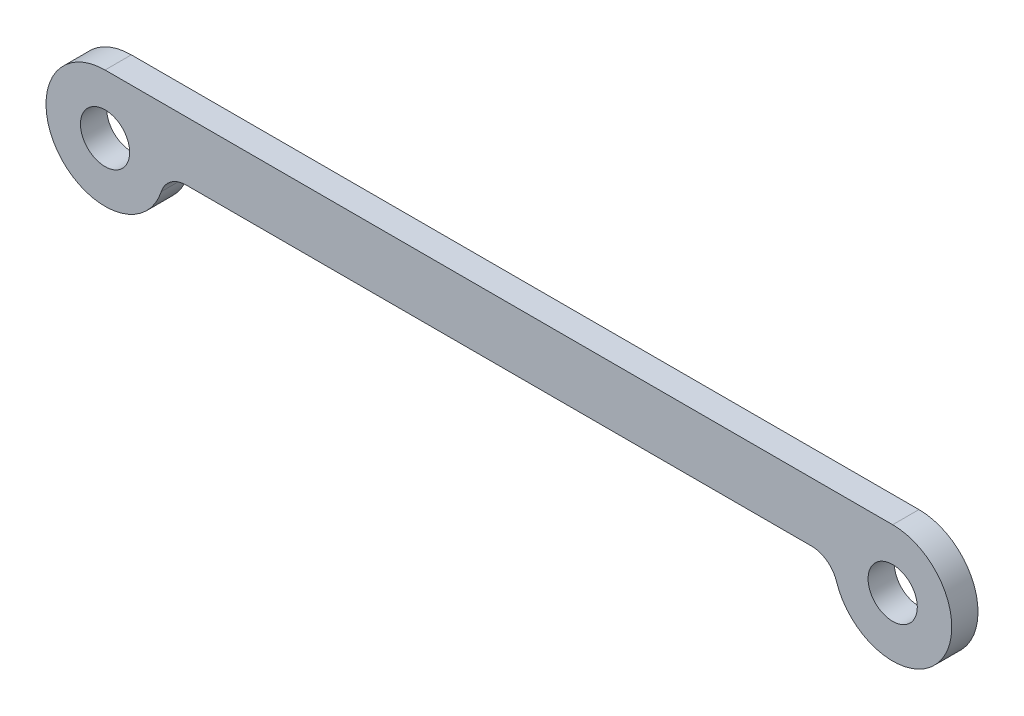
ISO-10303-21;
HEADER;
FILE_DESCRIPTION(('STEP AP214'),'2;1');
FILE_NAME('part.step','',(''),(''),'','','');
FILE_SCHEMA(('AUTOMOTIVE_DESIGN { 1 0 10303 214 1 1 1 1 }'));
ENDSEC;
DATA;
#1=APPLICATION_CONTEXT('core data for automotive mechanical design processes');
#2=APPLICATION_PROTOCOL_DEFINITION('international standard','automotive_design',2000,#1);
#3=PRODUCT_CONTEXT('',#1,'mechanical');
#4=PRODUCT('Part','Part','',(#3));
#5=PRODUCT_RELATED_PRODUCT_CATEGORY('part','',(#4));
#6=PRODUCT_DEFINITION_FORMATION('','',#4);
#7=PRODUCT_DEFINITION_CONTEXT('part definition',#1,'design');
#8=PRODUCT_DEFINITION('design','',#6,#7);
#9=PRODUCT_DEFINITION_SHAPE('','',#8);
#10=(LENGTH_UNIT() NAMED_UNIT(*) SI_UNIT(.MILLI.,.METRE.));
#11=(NAMED_UNIT(*) PLANE_ANGLE_UNIT() SI_UNIT($,.RADIAN.));
#12=(NAMED_UNIT(*) SI_UNIT($,.STERADIAN.) SOLID_ANGLE_UNIT());
#13=UNCERTAINTY_MEASURE_WITH_UNIT(LENGTH_MEASURE(1.E-05),#10,'distance_accuracy_value','');
#14=(GEOMETRIC_REPRESENTATION_CONTEXT(3) GLOBAL_UNCERTAINTY_ASSIGNED_CONTEXT((#13)) GLOBAL_UNIT_ASSIGNED_CONTEXT((#10,
#11,#12)) REPRESENTATION_CONTEXT('',''));
#15=CARTESIAN_POINT('',(0.,0.,0.));
#16=DIRECTION('',(0.,0.,1.));
#17=DIRECTION('',(1.,0.,0.));
#18=AXIS2_PLACEMENT_3D('',#15,#16,#17);
#19=CARTESIAN_POINT('',(60.,0.,2.));
#20=DIRECTION('',(0.,0.,1.));
#21=DIRECTION('',(1.,0.,0.));
#22=AXIS2_PLACEMENT_3D('',#19,#20,#21);
#23=PLANE('',#22);
#24=CARTESIAN_POINT('',(0.,0.,2.));
#25=DIRECTION('',(0.,0.,1.));
#26=DIRECTION('',(1.,0.,0.));
#27=AXIS2_PLACEMENT_3D('',#24,#25,#26);
#28=CIRCLE('',#27,1.875);
#29=CARTESIAN_POINT('',(1.87500000000005,0.,2.));
#30=VERTEX_POINT('',#29);
#31=EDGE_CURVE('E122',#30,#30,#28,.T.);
#32=ORIENTED_EDGE('',*,*,#31,.F.);
#33=EDGE_LOOP('',(#32));
#34=FACE_BOUND('',#33,.T.);
#35=CARTESIAN_POINT('',(60.,0.,2.));
#36=DIRECTION('',(0.,0.,1.));
#37=DIRECTION('',(1.,0.,0.));
#38=AXIS2_PLACEMENT_3D('',#35,#36,#37);
#39=CIRCLE('',#38,4.5);
#40=CARTESIAN_POINT('',(55.7183133887817,-1.38461538461538,2.));
#41=VERTEX_POINT('',#40);
#42=CARTESIAN_POINT('',(60.,4.5,2.));
#43=VERTEX_POINT('',#42);
#44=EDGE_CURVE('E129',#41,#43,#39,.T.);
#45=ORIENTED_EDGE('',*,*,#44,.T.);
#46=DIRECTION('',(-1.,0.,0.));
#47=VECTOR('',#46,1.);
#48=CARTESIAN_POINT('',(0.,4.5,2.));
#49=LINE('',#48,#47);
#50=CARTESIAN_POINT('',(0.,4.5,2.));
#51=VERTEX_POINT('',#50);
#52=EDGE_CURVE('E87',#43,#51,#49,.T.);
#53=ORIENTED_EDGE('',*,*,#52,.T.);
#54=CARTESIAN_POINT('',(0.,0.,2.));
#55=DIRECTION('',(0.,0.,1.));
#56=DIRECTION('',(1.,0.,0.));
#57=AXIS2_PLACEMENT_3D('',#54,#55,#56);
#58=CIRCLE('',#57,4.49999999999995);
#59=CARTESIAN_POINT('',(4.28168661121832,-1.38461538461537,2.));
#60=VERTEX_POINT('',#59);
#61=EDGE_CURVE('E100',#51,#60,#58,.T.);
#62=ORIENTED_EDGE('',*,*,#61,.T.);
#63=CARTESIAN_POINT('',(6.18465843842647,-2.00000000000001,2.));
#64=DIRECTION('',(0.,0.,-1.));
#65=DIRECTION('',(-1.,0.,0.));
#66=AXIS2_PLACEMENT_3D('',#63,#64,#65);
#67=CIRCLE('',#66,2.);
#68=CARTESIAN_POINT('',(6.18465843842647,0.,2.));
#69=VERTEX_POINT('',#68);
#70=EDGE_CURVE('E94',#60,#69,#67,.T.);
#71=ORIENTED_EDGE('',*,*,#70,.T.);
#72=DIRECTION('',(1.,0.,0.));
#73=VECTOR('',#72,1.);
#74=CARTESIAN_POINT('',(53.8153415615735,0.,2.));
#75=LINE('',#74,#73);
#76=CARTESIAN_POINT('',(53.8153415615735,0.,2.));
#77=VERTEX_POINT('',#76);
#78=EDGE_CURVE('E98',#69,#77,#75,.T.);
#79=ORIENTED_EDGE('',*,*,#78,.T.);
#80=CARTESIAN_POINT('',(53.8153415615735,-2.,2.));
#81=DIRECTION('',(0.,0.,-1.));
#82=DIRECTION('',(1.,0.,0.));
#83=AXIS2_PLACEMENT_3D('',#80,#81,#82);
#84=CIRCLE('',#83,2.);
#85=EDGE_CURVE('E50',#77,#41,#84,.T.);
#86=ORIENTED_EDGE('',*,*,#85,.T.);
#87=EDGE_LOOP('',(#45,#53,#62,#71,#79,#86));
#88=FACE_BOUND('',#87,.T.);
#89=CARTESIAN_POINT('',(60.,0.,2.));
#90=DIRECTION('',(0.,0.,1.));
#91=DIRECTION('',(1.,0.,0.));
#92=AXIS2_PLACEMENT_3D('',#89,#90,#91);
#93=CIRCLE('',#92,1.87499999999999);
#94=CARTESIAN_POINT('',(61.875,0.,2.));
#95=VERTEX_POINT('',#94);
#96=EDGE_CURVE('E171',#95,#95,#93,.T.);
#97=ORIENTED_EDGE('',*,*,#96,.F.);
#98=EDGE_LOOP('',(#97));
#99=FACE_BOUND('',#98,.T.);
#100=ADVANCED_FACE('F33',(#34,#88,#99),#23,.T.);
#101=CARTESIAN_POINT('',(60.,0.,0.));
#102=DIRECTION('',(0.,0.,1.));
#103=DIRECTION('',(1.,0.,0.));
#104=AXIS2_PLACEMENT_3D('',#101,#102,#103);
#105=PLANE('',#104);
#106=CARTESIAN_POINT('',(60.,0.,0.));
#107=DIRECTION('',(0.,0.,1.));
#108=DIRECTION('',(1.,0.,0.));
#109=AXIS2_PLACEMENT_3D('',#106,#107,#108);
#110=CIRCLE('',#109,4.5);
#111=CARTESIAN_POINT('',(55.7183133887817,-1.38461538461538,0.));
#112=VERTEX_POINT('',#111);
#113=CARTESIAN_POINT('',(60.,4.5,0.));
#114=VERTEX_POINT('',#113);
#115=EDGE_CURVE('E118',#112,#114,#110,.T.);
#116=ORIENTED_EDGE('',*,*,#115,.F.);
#117=CARTESIAN_POINT('',(53.8153415615735,-2.,0.));
#118=DIRECTION('',(0.,0.,-1.));
#119=DIRECTION('',(1.,0.,0.));
#120=AXIS2_PLACEMENT_3D('',#117,#118,#119);
#121=CIRCLE('',#120,2.);
#122=CARTESIAN_POINT('',(53.8153415615735,0.,0.));
#123=VERTEX_POINT('',#122);
#124=EDGE_CURVE('E79',#123,#112,#121,.T.);
#125=ORIENTED_EDGE('',*,*,#124,.F.);
#126=DIRECTION('',(1.,0.,0.));
#127=VECTOR('',#126,1.);
#128=CARTESIAN_POINT('',(53.8153415615735,0.,0.));
#129=LINE('',#128,#127);
#130=CARTESIAN_POINT('',(6.18465843842647,0.,0.));
#131=VERTEX_POINT('',#130);
#132=EDGE_CURVE('E73',#131,#123,#129,.T.);
#133=ORIENTED_EDGE('',*,*,#132,.F.);
#134=CARTESIAN_POINT('',(6.18465843842647,-2.00000000000001,0.));
#135=DIRECTION('',(0.,0.,-1.));
#136=DIRECTION('',(-1.,0.,0.));
#137=AXIS2_PLACEMENT_3D('',#134,#135,#136);
#138=CIRCLE('',#137,2.);
#139=CARTESIAN_POINT('',(4.28168661121832,-1.38461538461537,0.));
#140=VERTEX_POINT('',#139);
#141=EDGE_CURVE('E108',#140,#131,#138,.T.);
#142=ORIENTED_EDGE('',*,*,#141,.F.);
#143=CARTESIAN_POINT('',(0.,0.,0.));
#144=DIRECTION('',(0.,0.,1.));
#145=DIRECTION('',(1.,0.,0.));
#146=AXIS2_PLACEMENT_3D('',#143,#144,#145);
#147=CIRCLE('',#146,4.49999999999995);
#148=CARTESIAN_POINT('',(0.,4.5,0.));
#149=VERTEX_POINT('',#148);
#150=EDGE_CURVE('E124',#149,#140,#147,.T.);
#151=ORIENTED_EDGE('',*,*,#150,.F.);
#152=DIRECTION('',(-1.,0.,0.));
#153=VECTOR('',#152,1.);
#154=CARTESIAN_POINT('',(0.,4.5,0.));
#155=LINE('',#154,#153);
#156=EDGE_CURVE('E121',#114,#149,#155,.T.);
#157=ORIENTED_EDGE('',*,*,#156,.F.);
#158=EDGE_LOOP('',(#116,#125,#133,#142,#151,#157));
#159=FACE_BOUND('',#158,.T.);
#160=CARTESIAN_POINT('',(0.,0.,0.));
#161=DIRECTION('',(0.,0.,1.));
#162=DIRECTION('',(1.,0.,0.));
#163=AXIS2_PLACEMENT_3D('',#160,#161,#162);
#164=CIRCLE('',#163,1.875);
#165=CARTESIAN_POINT('',(1.87500000000005,0.,0.));
#166=VERTEX_POINT('',#165);
#167=EDGE_CURVE('E177',#166,#166,#164,.T.);
#168=ORIENTED_EDGE('',*,*,#167,.T.);
#169=EDGE_LOOP('',(#168));
#170=FACE_BOUND('',#169,.T.);
#171=CARTESIAN_POINT('',(60.,0.,0.));
#172=DIRECTION('',(0.,0.,1.));
#173=DIRECTION('',(1.,0.,0.));
#174=AXIS2_PLACEMENT_3D('',#171,#172,#173);
#175=CIRCLE('',#174,1.87499999999999);
#176=CARTESIAN_POINT('',(61.875,0.,0.));
#177=VERTEX_POINT('',#176);
#178=EDGE_CURVE('E174',#177,#177,#175,.T.);
#179=ORIENTED_EDGE('',*,*,#178,.T.);
#180=EDGE_LOOP('',(#179));
#181=FACE_BOUND('',#180,.T.);
#182=ADVANCED_FACE('F138',(#159,#170,#181),#105,.F.);
#183=CARTESIAN_POINT('',(60.,0.,2.));
#184=DIRECTION('',(0.,0.,-1.));
#185=DIRECTION('',(-1.,0.,0.));
#186=AXIS2_PLACEMENT_3D('',#183,#184,#185);
#187=CYLINDRICAL_SURFACE('',#186,4.5);
#188=ORIENTED_EDGE('',*,*,#115,.T.);
#189=DIRECTION('',(0.,0.,-1.));
#190=VECTOR('',#189,1.);
#191=CARTESIAN_POINT('',(60.,4.5,2.));
#192=LINE('',#191,#190);
#193=EDGE_CURVE('E11',#43,#114,#192,.T.);
#194=ORIENTED_EDGE('',*,*,#193,.F.);
#195=ORIENTED_EDGE('',*,*,#44,.F.);
#196=DIRECTION('',(0.,0.,-1.));
#197=VECTOR('',#196,1.);
#198=CARTESIAN_POINT('',(55.7183133887817,-1.38461538461538,2.));
#199=LINE('',#198,#197);
#200=EDGE_CURVE('E114',#41,#112,#199,.T.);
#201=ORIENTED_EDGE('',*,*,#200,.T.);
#202=EDGE_LOOP('',(#188,#194,#195,#201));
#203=FACE_BOUND('',#202,.T.);
#204=ADVANCED_FACE('F35',(#203),#187,.T.);
#205=CARTESIAN_POINT('',(0.,4.5,2.));
#206=DIRECTION('',(0.,-1.,0.));
#207=DIRECTION('',(0.,0.,-1.));
#208=AXIS2_PLACEMENT_3D('',#205,#206,#207);
#209=PLANE('',#208);
#210=ORIENTED_EDGE('',*,*,#156,.T.);
#211=DIRECTION('',(0.,0.,-1.));
#212=VECTOR('',#211,1.);
#213=CARTESIAN_POINT('',(0.,4.5,2.));
#214=LINE('',#213,#212);
#215=EDGE_CURVE('E42',#51,#149,#214,.T.);
#216=ORIENTED_EDGE('',*,*,#215,.F.);
#217=ORIENTED_EDGE('',*,*,#52,.F.);
#218=ORIENTED_EDGE('',*,*,#193,.T.);
#219=EDGE_LOOP('',(#210,#216,#217,#218));
#220=FACE_BOUND('',#219,.T.);
#221=ADVANCED_FACE('F218',(#220),#209,.F.);
#222=CARTESIAN_POINT('',(0.,0.,2.));
#223=DIRECTION('',(0.,0.,-1.));
#224=DIRECTION('',(-1.,0.,0.));
#225=AXIS2_PLACEMENT_3D('',#222,#223,#224);
#226=CYLINDRICAL_SURFACE('',#225,4.49999999999995);
#227=ORIENTED_EDGE('',*,*,#150,.T.);
#228=DIRECTION('',(0.,0.,-1.));
#229=VECTOR('',#228,1.);
#230=CARTESIAN_POINT('',(4.28168661121832,-1.38461538461537,2.));
#231=LINE('',#230,#229);
#232=EDGE_CURVE('E109',#60,#140,#231,.T.);
#233=ORIENTED_EDGE('',*,*,#232,.F.);
#234=ORIENTED_EDGE('',*,*,#61,.F.);
#235=ORIENTED_EDGE('',*,*,#215,.T.);
#236=EDGE_LOOP('',(#227,#233,#234,#235));
#237=FACE_BOUND('',#236,.T.);
#238=ADVANCED_FACE('F135',(#237),#226,.T.);
#239=CARTESIAN_POINT('',(6.18465843842647,-2.00000000000001,2.));
#240=DIRECTION('',(0.,0.,-1.));
#241=DIRECTION('',(-1.,0.,0.));
#242=AXIS2_PLACEMENT_3D('',#239,#240,#241);
#243=CYLINDRICAL_SURFACE('',#242,2.);
#244=ORIENTED_EDGE('',*,*,#141,.T.);
#245=DIRECTION('',(0.,0.,-1.));
#246=VECTOR('',#245,1.);
#247=CARTESIAN_POINT('',(6.18465843842647,0.,2.));
#248=LINE('',#247,#246);
#249=EDGE_CURVE('E105',#69,#131,#248,.T.);
#250=ORIENTED_EDGE('',*,*,#249,.F.);
#251=ORIENTED_EDGE('',*,*,#70,.F.);
#252=ORIENTED_EDGE('',*,*,#232,.T.);
#253=EDGE_LOOP('',(#244,#250,#251,#252));
#254=FACE_BOUND('',#253,.T.);
#255=ADVANCED_FACE('F106',(#254),#243,.F.);
#256=CARTESIAN_POINT('',(53.8153415615735,0.,2.));
#257=DIRECTION('',(0.,1.,0.));
#258=DIRECTION('',(-1.,0.,0.));
#259=AXIS2_PLACEMENT_3D('',#256,#257,#258);
#260=PLANE('',#259);
#261=ORIENTED_EDGE('',*,*,#132,.T.);
#262=DIRECTION('',(0.,0.,-1.));
#263=VECTOR('',#262,1.);
#264=CARTESIAN_POINT('',(53.8153415615735,0.,2.));
#265=LINE('',#264,#263);
#266=EDGE_CURVE('E110',#77,#123,#265,.T.);
#267=ORIENTED_EDGE('',*,*,#266,.F.);
#268=ORIENTED_EDGE('',*,*,#78,.F.);
#269=ORIENTED_EDGE('',*,*,#249,.T.);
#270=EDGE_LOOP('',(#261,#267,#268,#269));
#271=FACE_BOUND('',#270,.T.);
#272=ADVANCED_FACE('F112',(#271),#260,.F.);
#273=CARTESIAN_POINT('',(53.8153415615735,-2.,2.));
#274=DIRECTION('',(0.,0.,-1.));
#275=DIRECTION('',(-1.,0.,0.));
#276=AXIS2_PLACEMENT_3D('',#273,#274,#275);
#277=CYLINDRICAL_SURFACE('',#276,2.);
#278=ORIENTED_EDGE('',*,*,#124,.T.);
#279=ORIENTED_EDGE('',*,*,#200,.F.);
#280=ORIENTED_EDGE('',*,*,#85,.F.);
#281=ORIENTED_EDGE('',*,*,#266,.T.);
#282=EDGE_LOOP('',(#278,#279,#280,#281));
#283=FACE_BOUND('',#282,.T.);
#284=ADVANCED_FACE('F143',(#283),#277,.F.);
#285=CARTESIAN_POINT('',(0.,0.,2.));
#286=DIRECTION('',(0.,0.,-1.));
#287=DIRECTION('',(-1.,0.,0.));
#288=AXIS2_PLACEMENT_3D('',#285,#286,#287);
#289=CYLINDRICAL_SURFACE('',#288,1.875);
#290=ORIENTED_EDGE('',*,*,#31,.T.);
#291=EDGE_LOOP('',(#290));
#292=FACE_BOUND('',#291,.T.);
#293=ORIENTED_EDGE('',*,*,#167,.F.);
#294=EDGE_LOOP('',(#293));
#295=FACE_BOUND('',#294,.T.);
#296=ADVANCED_FACE('F145',(#292,#295),#289,.F.);
#297=CARTESIAN_POINT('',(60.,0.,2.));
#298=DIRECTION('',(0.,0.,-1.));
#299=DIRECTION('',(-1.,0.,0.));
#300=AXIS2_PLACEMENT_3D('',#297,#298,#299);
#301=CYLINDRICAL_SURFACE('',#300,1.87499999999999);
#302=ORIENTED_EDGE('',*,*,#96,.T.);
#303=EDGE_LOOP('',(#302));
#304=FACE_BOUND('',#303,.T.);
#305=ORIENTED_EDGE('',*,*,#178,.F.);
#306=EDGE_LOOP('',(#305));
#307=FACE_BOUND('',#306,.T.);
#308=ADVANCED_FACE('F151',(#304,#307),#301,.F.);
#309=CLOSED_SHELL('',(#100,#182,#204,#221,#238,#255,#272,#284,#296,#308));
#310=MANIFOLD_SOLID_BREP('B2',#309);
#311=ADVANCED_BREP_SHAPE_REPRESENTATION('',(#18,#310),#14);
#312=SHAPE_DEFINITION_REPRESENTATION(#9,#311);
ENDSEC;
END-ISO-10303-21;
